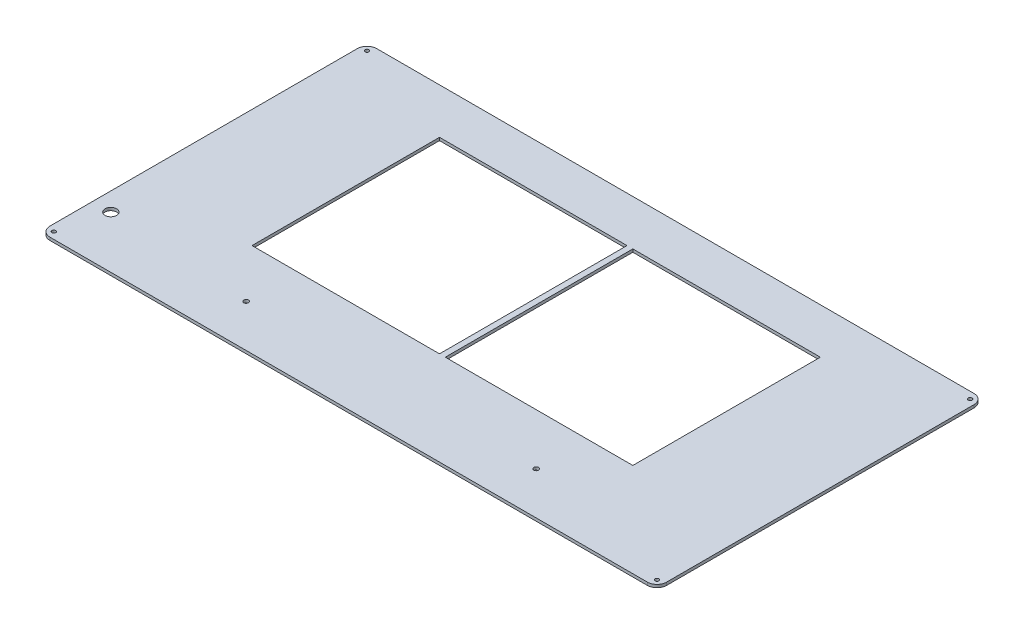
ISO-10303-21;
HEADER;
FILE_DESCRIPTION(('STEP AP214'),'2;1');
FILE_NAME('part.step','',(''),(''),'','','');
FILE_SCHEMA(('AUTOMOTIVE_DESIGN { 1 0 10303 214 1 1 1 1 }'));
ENDSEC;
DATA;
#1=APPLICATION_CONTEXT('core data for automotive mechanical design processes');
#2=APPLICATION_PROTOCOL_DEFINITION('international standard','automotive_design',2000,#1);
#3=PRODUCT_CONTEXT('',#1,'mechanical');
#4=PRODUCT('Part','Part','',(#3));
#5=PRODUCT_RELATED_PRODUCT_CATEGORY('part','',(#4));
#6=PRODUCT_DEFINITION_FORMATION('','',#4);
#7=PRODUCT_DEFINITION_CONTEXT('part definition',#1,'design');
#8=PRODUCT_DEFINITION('design','',#6,#7);
#9=PRODUCT_DEFINITION_SHAPE('','',#8);
#10=(LENGTH_UNIT() NAMED_UNIT(*) SI_UNIT(.MILLI.,.METRE.));
#11=(NAMED_UNIT(*) PLANE_ANGLE_UNIT() SI_UNIT($,.RADIAN.));
#12=(NAMED_UNIT(*) SI_UNIT($,.STERADIAN.) SOLID_ANGLE_UNIT());
#13=UNCERTAINTY_MEASURE_WITH_UNIT(LENGTH_MEASURE(1.E-05),#10,'distance_accuracy_value','');
#14=(GEOMETRIC_REPRESENTATION_CONTEXT(3) GLOBAL_UNCERTAINTY_ASSIGNED_CONTEXT((#13)) GLOBAL_UNIT_ASSIGNED_CONTEXT((#10,
#11,#12)) REPRESENTATION_CONTEXT('',''));
#15=CARTESIAN_POINT('',(0.,0.,0.));
#16=DIRECTION('',(0.,0.,1.));
#17=DIRECTION('',(1.,0.,0.));
#18=AXIS2_PLACEMENT_3D('',#15,#16,#17);
#19=CARTESIAN_POINT('',(0.,-3.,-344.));
#20=DIRECTION('',(0.,0.,-1.));
#21=DIRECTION('',(-1.,0.,0.));
#22=AXIS2_PLACEMENT_3D('',#19,#20,#21);
#23=PLANE('',#22);
#24=DIRECTION('',(-1.,0.,0.));
#25=VECTOR('',#24,1.);
#26=CARTESIAN_POINT('',(0.,0.,-344.));
#27=LINE('',#26,#25);
#28=CARTESIAN_POINT('',(634.,0.,-344.));
#29=VERTEX_POINT('',#28);
#30=CARTESIAN_POINT('',(16.0000000000001,0.,-344.));
#31=VERTEX_POINT('',#30);
#32=EDGE_CURVE('E257',#29,#31,#27,.T.);
#33=ORIENTED_EDGE('',*,*,#32,.F.);
#34=DIRECTION('',(0.,1.,0.));
#35=VECTOR('',#34,1.);
#36=CARTESIAN_POINT('',(634.,-3.,-344.));
#37=LINE('',#36,#35);
#38=CARTESIAN_POINT('',(634.,-3.,-344.));
#39=VERTEX_POINT('',#38);
#40=EDGE_CURVE('E11',#39,#29,#37,.T.);
#41=ORIENTED_EDGE('',*,*,#40,.F.);
#42=DIRECTION('',(-1.,0.,0.));
#43=VECTOR('',#42,1.);
#44=CARTESIAN_POINT('',(0.,-3.,-344.));
#45=LINE('',#44,#43);
#46=CARTESIAN_POINT('',(16.0000000000001,-3.,-344.));
#47=VERTEX_POINT('',#46);
#48=EDGE_CURVE('E320',#39,#47,#45,.T.);
#49=ORIENTED_EDGE('',*,*,#48,.T.);
#50=DIRECTION('',(0.,1.,0.));
#51=VECTOR('',#50,1.);
#52=CARTESIAN_POINT('',(16.0000000000001,-3.,-344.));
#53=LINE('',#52,#51);
#54=EDGE_CURVE('E190',#47,#31,#53,.T.);
#55=ORIENTED_EDGE('',*,*,#54,.T.);
#56=EDGE_LOOP('',(#33,#41,#49,#55));
#57=FACE_BOUND('',#56,.T.);
#58=ADVANCED_FACE('F37',(#57),#23,.T.);
#59=CARTESIAN_POINT('',(634.,-3.,-334.));
#60=DIRECTION('',(0.,1.,0.));
#61=DIRECTION('',(0.,0.,1.));
#62=AXIS2_PLACEMENT_3D('',#59,#60,#61);
#63=CYLINDRICAL_SURFACE('',#62,10.);
#64=CARTESIAN_POINT('',(634.,0.,-334.));
#65=DIRECTION('',(0.,1.,0.));
#66=DIRECTION('',(0.,0.,1.));
#67=AXIS2_PLACEMENT_3D('',#64,#65,#66);
#68=CIRCLE('',#67,10.);
#69=CARTESIAN_POINT('',(644.,0.,-334.));
#70=VERTEX_POINT('',#69);
#71=EDGE_CURVE('E275',#29,#70,#68,.F.);
#72=ORIENTED_EDGE('',*,*,#71,.T.);
#73=DIRECTION('',(0.,1.,0.));
#74=VECTOR('',#73,1.);
#75=CARTESIAN_POINT('',(644.,-3.,-334.));
#76=LINE('',#75,#74);
#77=CARTESIAN_POINT('',(644.,-3.,-334.));
#78=VERTEX_POINT('',#77);
#79=EDGE_CURVE('E47',#78,#70,#76,.T.);
#80=ORIENTED_EDGE('',*,*,#79,.F.);
#81=CARTESIAN_POINT('',(634.,-3.,-334.));
#82=DIRECTION('',(0.,1.,0.));
#83=DIRECTION('',(0.,0.,1.));
#84=AXIS2_PLACEMENT_3D('',#81,#82,#83);
#85=CIRCLE('',#84,10.);
#86=EDGE_CURVE('E175',#39,#78,#85,.F.);
#87=ORIENTED_EDGE('',*,*,#86,.F.);
#88=ORIENTED_EDGE('',*,*,#40,.T.);
#89=EDGE_LOOP('',(#72,#80,#87,#88));
#90=FACE_BOUND('',#89,.T.);
#91=ADVANCED_FACE('F357',(#90),#63,.T.);
#92=CARTESIAN_POINT('',(644.,-3.,0.));
#93=DIRECTION('',(-1.,0.,0.));
#94=DIRECTION('',(0.,0.,1.));
#95=AXIS2_PLACEMENT_3D('',#92,#93,#94);
#96=PLANE('',#95);
#97=DIRECTION('',(0.,0.,1.));
#98=VECTOR('',#97,1.);
#99=CARTESIAN_POINT('',(644.,0.,0.));
#100=LINE('',#99,#98);
#101=CARTESIAN_POINT('',(644.,0.,-16.0000000000001));
#102=VERTEX_POINT('',#101);
#103=EDGE_CURVE('E107',#70,#102,#100,.T.);
#104=ORIENTED_EDGE('',*,*,#103,.T.);
#105=DIRECTION('',(0.,1.,0.));
#106=VECTOR('',#105,1.);
#107=CARTESIAN_POINT('',(644.,-3.,-16.0000000000001));
#108=LINE('',#107,#106);
#109=CARTESIAN_POINT('',(644.,-3.,-16.0000000000001));
#110=VERTEX_POINT('',#109);
#111=EDGE_CURVE('E165',#110,#102,#108,.T.);
#112=ORIENTED_EDGE('',*,*,#111,.F.);
#113=DIRECTION('',(0.,0.,1.));
#114=VECTOR('',#113,1.);
#115=CARTESIAN_POINT('',(644.,-3.,0.));
#116=LINE('',#115,#114);
#117=EDGE_CURVE('E169',#78,#110,#116,.T.);
#118=ORIENTED_EDGE('',*,*,#117,.F.);
#119=ORIENTED_EDGE('',*,*,#79,.T.);
#120=EDGE_LOOP('',(#104,#112,#118,#119));
#121=FACE_BOUND('',#120,.T.);
#122=ADVANCED_FACE('F179',(#121),#96,.F.);
#123=CARTESIAN_POINT('',(634.,-3.,-16.));
#124=DIRECTION('',(0.,1.,0.));
#125=DIRECTION('',(0.,0.,1.));
#126=AXIS2_PLACEMENT_3D('',#123,#124,#125);
#127=CYLINDRICAL_SURFACE('',#126,10.);
#128=CARTESIAN_POINT('',(634.,0.,-16.));
#129=DIRECTION('',(0.,1.,0.));
#130=DIRECTION('',(0.,0.,1.));
#131=AXIS2_PLACEMENT_3D('',#128,#129,#130);
#132=CIRCLE('',#131,10.);
#133=CARTESIAN_POINT('',(634.,0.,-6.00000000000001));
#134=VERTEX_POINT('',#133);
#135=EDGE_CURVE('E272',#102,#134,#132,.F.);
#136=ORIENTED_EDGE('',*,*,#135,.T.);
#137=DIRECTION('',(0.,1.,0.));
#138=VECTOR('',#137,1.);
#139=CARTESIAN_POINT('',(634.,-3.,-6.00000000000001));
#140=LINE('',#139,#138);
#141=CARTESIAN_POINT('',(634.,-3.,-6.00000000000001));
#142=VERTEX_POINT('',#141);
#143=EDGE_CURVE('E167',#142,#134,#140,.T.);
#144=ORIENTED_EDGE('',*,*,#143,.F.);
#145=CARTESIAN_POINT('',(634.,-3.,-16.));
#146=DIRECTION('',(0.,1.,0.));
#147=DIRECTION('',(0.,0.,1.));
#148=AXIS2_PLACEMENT_3D('',#145,#146,#147);
#149=CIRCLE('',#148,10.);
#150=EDGE_CURVE('E160',#110,#142,#149,.F.);
#151=ORIENTED_EDGE('',*,*,#150,.F.);
#152=ORIENTED_EDGE('',*,*,#111,.T.);
#153=EDGE_LOOP('',(#136,#144,#151,#152));
#154=FACE_BOUND('',#153,.T.);
#155=ADVANCED_FACE('F163',(#154),#127,.T.);
#156=CARTESIAN_POINT('',(0.,-3.,-6.00000000000001));
#157=DIRECTION('',(0.,0.,-1.));
#158=DIRECTION('',(-1.,0.,0.));
#159=AXIS2_PLACEMENT_3D('',#156,#157,#158);
#160=PLANE('',#159);
#161=DIRECTION('',(-1.,0.,0.));
#162=VECTOR('',#161,1.);
#163=CARTESIAN_POINT('',(0.,0.,-6.00000000000001));
#164=LINE('',#163,#162);
#165=CARTESIAN_POINT('',(16.0000000000001,0.,-6.00000000000001));
#166=VERTEX_POINT('',#165);
#167=EDGE_CURVE('E269',#134,#166,#164,.T.);
#168=ORIENTED_EDGE('',*,*,#167,.T.);
#169=DIRECTION('',(0.,1.,0.));
#170=VECTOR('',#169,1.);
#171=CARTESIAN_POINT('',(16.0000000000001,-3.,-6.00000000000001));
#172=LINE('',#171,#170);
#173=CARTESIAN_POINT('',(16.0000000000001,-3.,-6.00000000000001));
#174=VERTEX_POINT('',#173);
#175=EDGE_CURVE('E182',#174,#166,#172,.T.);
#176=ORIENTED_EDGE('',*,*,#175,.F.);
#177=DIRECTION('',(-1.,0.,0.));
#178=VECTOR('',#177,1.);
#179=CARTESIAN_POINT('',(0.,-3.,-6.00000000000001));
#180=LINE('',#179,#178);
#181=EDGE_CURVE('E170',#142,#174,#180,.T.);
#182=ORIENTED_EDGE('',*,*,#181,.F.);
#183=ORIENTED_EDGE('',*,*,#143,.T.);
#184=EDGE_LOOP('',(#168,#176,#182,#183));
#185=FACE_BOUND('',#184,.T.);
#186=ADVANCED_FACE('F333',(#185),#160,.F.);
#187=CARTESIAN_POINT('',(16.,-3.,-16.));
#188=DIRECTION('',(0.,1.,0.));
#189=DIRECTION('',(0.,0.,1.));
#190=AXIS2_PLACEMENT_3D('',#187,#188,#189);
#191=CYLINDRICAL_SURFACE('',#190,10.);
#192=CARTESIAN_POINT('',(16.,0.,-16.));
#193=DIRECTION('',(0.,1.,0.));
#194=DIRECTION('',(0.,0.,1.));
#195=AXIS2_PLACEMENT_3D('',#192,#193,#194);
#196=CIRCLE('',#195,10.);
#197=CARTESIAN_POINT('',(6.00000000000001,0.,-16.0000000000001));
#198=VERTEX_POINT('',#197);
#199=EDGE_CURVE('E266',#198,#166,#196,.T.);
#200=ORIENTED_EDGE('',*,*,#199,.F.);
#201=DIRECTION('',(0.,1.,0.));
#202=VECTOR('',#201,1.);
#203=CARTESIAN_POINT('',(6.00000000000001,-3.,-16.0000000000001));
#204=LINE('',#203,#202);
#205=CARTESIAN_POINT('',(6.00000000000001,-3.,-16.0000000000001));
#206=VERTEX_POINT('',#205);
#207=EDGE_CURVE('E186',#206,#198,#204,.T.);
#208=ORIENTED_EDGE('',*,*,#207,.F.);
#209=CARTESIAN_POINT('',(16.,-3.,-16.));
#210=DIRECTION('',(0.,1.,0.));
#211=DIRECTION('',(0.,0.,1.));
#212=AXIS2_PLACEMENT_3D('',#209,#210,#211);
#213=CIRCLE('',#212,10.);
#214=EDGE_CURVE('E327',#206,#174,#213,.T.);
#215=ORIENTED_EDGE('',*,*,#214,.T.);
#216=ORIENTED_EDGE('',*,*,#175,.T.);
#217=EDGE_LOOP('',(#200,#208,#215,#216));
#218=FACE_BOUND('',#217,.T.);
#219=ADVANCED_FACE('F336',(#218),#191,.T.);
#220=CARTESIAN_POINT('',(6.00000000000001,-3.,0.));
#221=DIRECTION('',(1.,0.,0.));
#222=DIRECTION('',(0.,0.,-1.));
#223=AXIS2_PLACEMENT_3D('',#220,#221,#222);
#224=PLANE('',#223);
#225=DIRECTION('',(0.,0.,-1.));
#226=VECTOR('',#225,1.);
#227=CARTESIAN_POINT('',(6.00000000000001,0.,0.));
#228=LINE('',#227,#226);
#229=CARTESIAN_POINT('',(6.00000000000001,0.,-334.));
#230=VERTEX_POINT('',#229);
#231=EDGE_CURVE('E263',#198,#230,#228,.T.);
#232=ORIENTED_EDGE('',*,*,#231,.T.);
#233=DIRECTION('',(0.,1.,0.));
#234=VECTOR('',#233,1.);
#235=CARTESIAN_POINT('',(6.00000000000001,-3.,-334.));
#236=LINE('',#235,#234);
#237=CARTESIAN_POINT('',(6.00000000000001,-3.,-334.));
#238=VERTEX_POINT('',#237);
#239=EDGE_CURVE('E188',#238,#230,#236,.T.);
#240=ORIENTED_EDGE('',*,*,#239,.F.);
#241=DIRECTION('',(0.,0.,-1.));
#242=VECTOR('',#241,1.);
#243=CARTESIAN_POINT('',(6.00000000000001,-3.,0.));
#244=LINE('',#243,#242);
#245=EDGE_CURVE('E325',#206,#238,#244,.T.);
#246=ORIENTED_EDGE('',*,*,#245,.F.);
#247=ORIENTED_EDGE('',*,*,#207,.T.);
#248=EDGE_LOOP('',(#232,#240,#246,#247));
#249=FACE_BOUND('',#248,.T.);
#250=ADVANCED_FACE('F341',(#249),#224,.F.);
#251=CARTESIAN_POINT('',(0.,-3.,-103.));
#252=DIRECTION('',(0.,0.,-1.));
#253=DIRECTION('',(-1.,0.,0.));
#254=AXIS2_PLACEMENT_3D('',#251,#252,#253);
#255=PLANE('',#254);
#256=DIRECTION('',(-1.,0.,0.));
#257=VECTOR('',#256,1.);
#258=CARTESIAN_POINT('',(0.,0.,-103.));
#259=LINE('',#258,#257);
#260=CARTESIAN_POINT('',(522.,0.,-103.));
#261=VERTEX_POINT('',#260);
#262=CARTESIAN_POINT('',(328.,0.,-103.));
#263=VERTEX_POINT('',#262);
#264=EDGE_CURVE('E224',#261,#263,#259,.T.);
#265=ORIENTED_EDGE('',*,*,#264,.F.);
#266=DIRECTION('',(0.,1.,0.));
#267=VECTOR('',#266,1.);
#268=CARTESIAN_POINT('',(522.,-3.,-103.));
#269=LINE('',#268,#267);
#270=CARTESIAN_POINT('',(522.,-3.,-103.));
#271=VERTEX_POINT('',#270);
#272=EDGE_CURVE('E192',#271,#261,#269,.T.);
#273=ORIENTED_EDGE('',*,*,#272,.F.);
#274=DIRECTION('',(-1.,0.,0.));
#275=VECTOR('',#274,1.);
#276=CARTESIAN_POINT('',(0.,-3.,-103.));
#277=LINE('',#276,#275);
#278=CARTESIAN_POINT('',(328.,-3.,-103.));
#279=VERTEX_POINT('',#278);
#280=EDGE_CURVE('E288',#271,#279,#277,.T.);
#281=ORIENTED_EDGE('',*,*,#280,.T.);
#282=DIRECTION('',(0.,1.,0.));
#283=VECTOR('',#282,1.);
#284=CARTESIAN_POINT('',(328.,-3.,-103.));
#285=LINE('',#284,#283);
#286=EDGE_CURVE('E199',#279,#263,#285,.T.);
#287=ORIENTED_EDGE('',*,*,#286,.T.);
#288=EDGE_LOOP('',(#265,#273,#281,#287));
#289=FACE_BOUND('',#288,.T.);
#290=ADVANCED_FACE('F399',(#289),#255,.T.);
#291=CARTESIAN_POINT('',(522.,-3.,0.));
#292=DIRECTION('',(1.,0.,0.));
#293=DIRECTION('',(0.,0.,-1.));
#294=AXIS2_PLACEMENT_3D('',#291,#292,#293);
#295=PLANE('',#294);
#296=DIRECTION('',(0.,0.,-1.));
#297=VECTOR('',#296,1.);
#298=CARTESIAN_POINT('',(522.,0.,0.));
#299=LINE('',#298,#297);
#300=CARTESIAN_POINT('',(522.,0.,-297.));
#301=VERTEX_POINT('',#300);
#302=EDGE_CURVE('E233',#261,#301,#299,.T.);
#303=ORIENTED_EDGE('',*,*,#302,.T.);
#304=DIRECTION('',(0.,1.,0.));
#305=VECTOR('',#304,1.);
#306=CARTESIAN_POINT('',(522.,-3.,-297.));
#307=LINE('',#306,#305);
#308=CARTESIAN_POINT('',(522.,-3.,-297.));
#309=VERTEX_POINT('',#308);
#310=EDGE_CURVE('E194',#309,#301,#307,.T.);
#311=ORIENTED_EDGE('',*,*,#310,.F.);
#312=DIRECTION('',(0.,0.,-1.));
#313=VECTOR('',#312,1.);
#314=CARTESIAN_POINT('',(522.,-3.,0.));
#315=LINE('',#314,#313);
#316=EDGE_CURVE('E296',#271,#309,#315,.T.);
#317=ORIENTED_EDGE('',*,*,#316,.F.);
#318=ORIENTED_EDGE('',*,*,#272,.T.);
#319=EDGE_LOOP('',(#303,#311,#317,#318));
#320=FACE_BOUND('',#319,.T.);
#321=ADVANCED_FACE('F395',(#320),#295,.F.);
#322=CARTESIAN_POINT('',(0.,-3.,-297.));
#323=DIRECTION('',(0.,0.,-1.));
#324=DIRECTION('',(-1.,0.,0.));
#325=AXIS2_PLACEMENT_3D('',#322,#323,#324);
#326=PLANE('',#325);
#327=DIRECTION('',(-1.,0.,0.));
#328=VECTOR('',#327,1.);
#329=CARTESIAN_POINT('',(0.,0.,-297.));
#330=LINE('',#329,#328);
#331=CARTESIAN_POINT('',(328.,0.,-297.));
#332=VERTEX_POINT('',#331);
#333=EDGE_CURVE('E230',#301,#332,#330,.T.);
#334=ORIENTED_EDGE('',*,*,#333,.T.);
#335=DIRECTION('',(0.,1.,0.));
#336=VECTOR('',#335,1.);
#337=CARTESIAN_POINT('',(328.,-3.,-297.));
#338=LINE('',#337,#336);
#339=CARTESIAN_POINT('',(328.,-3.,-297.));
#340=VERTEX_POINT('',#339);
#341=EDGE_CURVE('E197',#340,#332,#338,.T.);
#342=ORIENTED_EDGE('',*,*,#341,.F.);
#343=DIRECTION('',(-1.,0.,0.));
#344=VECTOR('',#343,1.);
#345=CARTESIAN_POINT('',(0.,-3.,-297.));
#346=LINE('',#345,#344);
#347=EDGE_CURVE('E294',#309,#340,#346,.T.);
#348=ORIENTED_EDGE('',*,*,#347,.F.);
#349=ORIENTED_EDGE('',*,*,#310,.T.);
#350=EDGE_LOOP('',(#334,#342,#348,#349));
#351=FACE_BOUND('',#350,.T.);
#352=ADVANCED_FACE('F398',(#351),#326,.F.);
#353=CARTESIAN_POINT('',(0.,-3.,-297.));
#354=DIRECTION('',(0.,0.,-1.));
#355=DIRECTION('',(-1.,0.,0.));
#356=AXIS2_PLACEMENT_3D('',#353,#354,#355);
#357=PLANE('',#356);
#358=DIRECTION('',(-1.,0.,0.));
#359=VECTOR('',#358,1.);
#360=CARTESIAN_POINT('',(0.,0.,-297.));
#361=LINE('',#360,#359);
#362=CARTESIAN_POINT('',(322.,0.,-297.));
#363=VERTEX_POINT('',#362);
#364=CARTESIAN_POINT('',(128.,0.,-297.));
#365=VERTEX_POINT('',#364);
#366=EDGE_CURVE('E214',#363,#365,#361,.T.);
#367=ORIENTED_EDGE('',*,*,#366,.T.);
#368=DIRECTION('',(0.,1.,0.));
#369=VECTOR('',#368,1.);
#370=CARTESIAN_POINT('',(128.,-3.,-297.));
#371=LINE('',#370,#369);
#372=CARTESIAN_POINT('',(128.,-3.,-297.));
#373=VERTEX_POINT('',#372);
#374=EDGE_CURVE('E201',#373,#365,#371,.T.);
#375=ORIENTED_EDGE('',*,*,#374,.F.);
#376=DIRECTION('',(-1.,0.,0.));
#377=VECTOR('',#376,1.);
#378=CARTESIAN_POINT('',(0.,-3.,-297.));
#379=LINE('',#378,#377);
#380=CARTESIAN_POINT('',(322.,-3.,-297.));
#381=VERTEX_POINT('',#380);
#382=EDGE_CURVE('E276',#381,#373,#379,.T.);
#383=ORIENTED_EDGE('',*,*,#382,.F.);
#384=DIRECTION('',(0.,1.,0.));
#385=VECTOR('',#384,1.);
#386=CARTESIAN_POINT('',(322.,-3.,-297.));
#387=LINE('',#386,#385);
#388=EDGE_CURVE('E41',#381,#363,#387,.T.);
#389=ORIENTED_EDGE('',*,*,#388,.T.);
#390=EDGE_LOOP('',(#367,#375,#383,#389));
#391=FACE_BOUND('',#390,.T.);
#392=ADVANCED_FACE('F39',(#391),#357,.F.);
#393=CARTESIAN_POINT('',(128.,-3.,0.));
#394=DIRECTION('',(1.,0.,0.));
#395=DIRECTION('',(0.,0.,-1.));
#396=AXIS2_PLACEMENT_3D('',#393,#394,#395);
#397=PLANE('',#396);
#398=DIRECTION('',(0.,0.,-1.));
#399=VECTOR('',#398,1.);
#400=CARTESIAN_POINT('',(128.,0.,0.));
#401=LINE('',#400,#399);
#402=CARTESIAN_POINT('',(128.,0.,-103.));
#403=VERTEX_POINT('',#402);
#404=EDGE_CURVE('E221',#403,#365,#401,.T.);
#405=ORIENTED_EDGE('',*,*,#404,.F.);
#406=DIRECTION('',(0.,1.,0.));
#407=VECTOR('',#406,1.);
#408=CARTESIAN_POINT('',(128.,-3.,-103.));
#409=LINE('',#408,#407);
#410=CARTESIAN_POINT('',(128.,-3.,-103.));
#411=VERTEX_POINT('',#410);
#412=EDGE_CURVE('E203',#411,#403,#409,.T.);
#413=ORIENTED_EDGE('',*,*,#412,.F.);
#414=DIRECTION('',(0.,0.,-1.));
#415=VECTOR('',#414,1.);
#416=CARTESIAN_POINT('',(128.,-3.,0.));
#417=LINE('',#416,#415);
#418=EDGE_CURVE('E285',#411,#373,#417,.T.);
#419=ORIENTED_EDGE('',*,*,#418,.T.);
#420=ORIENTED_EDGE('',*,*,#374,.T.);
#421=EDGE_LOOP('',(#405,#413,#419,#420));
#422=FACE_BOUND('',#421,.T.);
#423=ADVANCED_FACE('F411',(#422),#397,.T.);
#424=CARTESIAN_POINT('',(0.,-3.,-103.));
#425=DIRECTION('',(0.,0.,-1.));
#426=DIRECTION('',(-1.,0.,0.));
#427=AXIS2_PLACEMENT_3D('',#424,#425,#426);
#428=PLANE('',#427);
#429=DIRECTION('',(-1.,0.,0.));
#430=VECTOR('',#429,1.);
#431=CARTESIAN_POINT('',(0.,0.,-103.));
#432=LINE('',#431,#430);
#433=CARTESIAN_POINT('',(322.,0.,-103.));
#434=VERTEX_POINT('',#433);
#435=EDGE_CURVE('E218',#434,#403,#432,.T.);
#436=ORIENTED_EDGE('',*,*,#435,.F.);
#437=DIRECTION('',(0.,1.,0.));
#438=VECTOR('',#437,1.);
#439=CARTESIAN_POINT('',(322.,-3.,-103.));
#440=LINE('',#439,#438);
#441=CARTESIAN_POINT('',(322.,-3.,-103.));
#442=VERTEX_POINT('',#441);
#443=EDGE_CURVE('E204',#442,#434,#440,.T.);
#444=ORIENTED_EDGE('',*,*,#443,.F.);
#445=DIRECTION('',(-1.,0.,0.));
#446=VECTOR('',#445,1.);
#447=CARTESIAN_POINT('',(0.,-3.,-103.));
#448=LINE('',#447,#446);
#449=EDGE_CURVE('E280',#442,#411,#448,.T.);
#450=ORIENTED_EDGE('',*,*,#449,.T.);
#451=ORIENTED_EDGE('',*,*,#412,.T.);
#452=EDGE_LOOP('',(#436,#444,#450,#451));
#453=FACE_BOUND('',#452,.T.);
#454=ADVANCED_FACE('F369',(#453),#428,.T.);
#455=CARTESIAN_POINT('',(25.,-3.,-60.));
#456=DIRECTION('',(0.,1.,0.));
#457=DIRECTION('',(0.,0.,1.));
#458=AXIS2_PLACEMENT_3D('',#455,#456,#457);
#459=CYLINDRICAL_SURFACE('',#458,6.00000000000001);
#460=CARTESIAN_POINT('',(25.,-3.,-60.));
#461=DIRECTION('',(0.,1.,0.));
#462=DIRECTION('',(0.,0.,1.));
#463=AXIS2_PLACEMENT_3D('',#460,#461,#462);
#464=CIRCLE('',#463,6.00000000000001);
#465=CARTESIAN_POINT('',(25.,-3.,-54.));
#466=VERTEX_POINT('',#465);
#467=EDGE_CURVE('E317',#466,#466,#464,.T.);
#468=ORIENTED_EDGE('',*,*,#467,.F.);
#469=EDGE_LOOP('',(#468));
#470=FACE_BOUND('',#469,.T.);
#471=CARTESIAN_POINT('',(25.,0.,-60.));
#472=DIRECTION('',(0.,1.,0.));
#473=DIRECTION('',(0.,0.,1.));
#474=AXIS2_PLACEMENT_3D('',#471,#472,#473);
#475=CIRCLE('',#474,6.00000000000001);
#476=CARTESIAN_POINT('',(25.,0.,-54.));
#477=VERTEX_POINT('',#476);
#478=EDGE_CURVE('E254',#477,#477,#475,.T.);
#479=ORIENTED_EDGE('',*,*,#478,.T.);
#480=EDGE_LOOP('',(#479));
#481=FACE_BOUND('',#480,.T.);
#482=ADVANCED_FACE('F365',(#470,#481),#459,.F.);
#483=CARTESIAN_POINT('',(175.,-3.,-50.));
#484=DIRECTION('',(0.,1.,0.));
#485=DIRECTION('',(0.,0.,1.));
#486=AXIS2_PLACEMENT_3D('',#483,#484,#485);
#487=CYLINDRICAL_SURFACE('',#486,2.50000000000002);
#488=CARTESIAN_POINT('',(175.,-3.,-50.));
#489=DIRECTION('',(0.,1.,0.));
#490=DIRECTION('',(0.,0.,1.));
#491=AXIS2_PLACEMENT_3D('',#488,#489,#490);
#492=CIRCLE('',#491,2.50000000000002);
#493=CARTESIAN_POINT('',(175.,-3.,-47.5));
#494=VERTEX_POINT('',#493);
#495=EDGE_CURVE('E314',#494,#494,#492,.T.);
#496=ORIENTED_EDGE('',*,*,#495,.F.);
#497=EDGE_LOOP('',(#496));
#498=FACE_BOUND('',#497,.T.);
#499=CARTESIAN_POINT('',(175.,0.,-50.));
#500=DIRECTION('',(0.,1.,0.));
#501=DIRECTION('',(0.,0.,1.));
#502=AXIS2_PLACEMENT_3D('',#499,#500,#501);
#503=CIRCLE('',#502,2.50000000000002);
#504=CARTESIAN_POINT('',(175.,0.,-47.5));
#505=VERTEX_POINT('',#504);
#506=EDGE_CURVE('E251',#505,#505,#503,.T.);
#507=ORIENTED_EDGE('',*,*,#506,.T.);
#508=EDGE_LOOP('',(#507));
#509=FACE_BOUND('',#508,.T.);
#510=ADVANCED_FACE('F368',(#498,#509),#487,.F.);
#511=CARTESIAN_POINT('',(475.,-3.,-50.));
#512=DIRECTION('',(0.,1.,0.));
#513=DIRECTION('',(0.,0.,1.));
#514=AXIS2_PLACEMENT_3D('',#511,#512,#513);
#515=CYLINDRICAL_SURFACE('',#514,2.50000000000002);
#516=CARTESIAN_POINT('',(475.,-3.,-50.));
#517=DIRECTION('',(0.,1.,0.));
#518=DIRECTION('',(0.,0.,1.));
#519=AXIS2_PLACEMENT_3D('',#516,#517,#518);
#520=CIRCLE('',#519,2.50000000000002);
#521=CARTESIAN_POINT('',(475.,-3.,-47.5));
#522=VERTEX_POINT('',#521);
#523=EDGE_CURVE('E311',#522,#522,#520,.T.);
#524=ORIENTED_EDGE('',*,*,#523,.F.);
#525=EDGE_LOOP('',(#524));
#526=FACE_BOUND('',#525,.T.);
#527=CARTESIAN_POINT('',(475.,0.,-50.));
#528=DIRECTION('',(0.,1.,0.));
#529=DIRECTION('',(0.,0.,1.));
#530=AXIS2_PLACEMENT_3D('',#527,#528,#529);
#531=CIRCLE('',#530,2.50000000000002);
#532=CARTESIAN_POINT('',(475.,0.,-47.5));
#533=VERTEX_POINT('',#532);
#534=EDGE_CURVE('E248',#533,#533,#531,.T.);
#535=ORIENTED_EDGE('',*,*,#534,.T.);
#536=EDGE_LOOP('',(#535));
#537=FACE_BOUND('',#536,.T.);
#538=ADVANCED_FACE('F373',(#526,#537),#515,.F.);
#539=CARTESIAN_POINT('',(637.,-3.,-337.));
#540=DIRECTION('',(0.,1.,0.));
#541=DIRECTION('',(0.,0.,1.));
#542=AXIS2_PLACEMENT_3D('',#539,#540,#541);
#543=CYLINDRICAL_SURFACE('',#542,2.);
#544=CARTESIAN_POINT('',(637.,-3.,-337.));
#545=DIRECTION('',(0.,1.,0.));
#546=DIRECTION('',(0.,0.,1.));
#547=AXIS2_PLACEMENT_3D('',#544,#545,#546);
#548=CIRCLE('',#547,2.);
#549=CARTESIAN_POINT('',(637.,-3.,-335.));
#550=VERTEX_POINT('',#549);
#551=EDGE_CURVE('E308',#550,#550,#548,.T.);
#552=ORIENTED_EDGE('',*,*,#551,.F.);
#553=EDGE_LOOP('',(#552));
#554=FACE_BOUND('',#553,.T.);
#555=CARTESIAN_POINT('',(637.,0.,-337.));
#556=DIRECTION('',(0.,1.,0.));
#557=DIRECTION('',(0.,0.,1.));
#558=AXIS2_PLACEMENT_3D('',#555,#556,#557);
#559=CIRCLE('',#558,2.);
#560=CARTESIAN_POINT('',(637.,0.,-335.));
#561=VERTEX_POINT('',#560);
#562=EDGE_CURVE('E245',#561,#561,#559,.T.);
#563=ORIENTED_EDGE('',*,*,#562,.T.);
#564=EDGE_LOOP('',(#563));
#565=FACE_BOUND('',#564,.T.);
#566=ADVANCED_FACE('F377',(#554,#565),#543,.F.);
#567=CARTESIAN_POINT('',(13.,-3.,-337.));
#568=DIRECTION('',(0.,1.,0.));
#569=DIRECTION('',(0.,0.,1.));
#570=AXIS2_PLACEMENT_3D('',#567,#568,#569);
#571=CYLINDRICAL_SURFACE('',#570,2.);
#572=CARTESIAN_POINT('',(13.,-3.,-337.));
#573=DIRECTION('',(0.,1.,0.));
#574=DIRECTION('',(0.,0.,1.));
#575=AXIS2_PLACEMENT_3D('',#572,#573,#574);
#576=CIRCLE('',#575,2.);
#577=CARTESIAN_POINT('',(13.,-3.,-335.));
#578=VERTEX_POINT('',#577);
#579=EDGE_CURVE('E305',#578,#578,#576,.T.);
#580=ORIENTED_EDGE('',*,*,#579,.F.);
#581=EDGE_LOOP('',(#580));
#582=FACE_BOUND('',#581,.T.);
#583=CARTESIAN_POINT('',(13.,0.,-337.));
#584=DIRECTION('',(0.,1.,0.));
#585=DIRECTION('',(0.,0.,1.));
#586=AXIS2_PLACEMENT_3D('',#583,#584,#585);
#587=CIRCLE('',#586,2.);
#588=CARTESIAN_POINT('',(13.,0.,-335.));
#589=VERTEX_POINT('',#588);
#590=EDGE_CURVE('E242',#589,#589,#587,.T.);
#591=ORIENTED_EDGE('',*,*,#590,.T.);
#592=EDGE_LOOP('',(#591));
#593=FACE_BOUND('',#592,.T.);
#594=ADVANCED_FACE('F381',(#582,#593),#571,.F.);
#595=CARTESIAN_POINT('',(637.,-3.,-13.));
#596=DIRECTION('',(0.,1.,0.));
#597=DIRECTION('',(0.,0.,1.));
#598=AXIS2_PLACEMENT_3D('',#595,#596,#597);
#599=CYLINDRICAL_SURFACE('',#598,2.);
#600=CARTESIAN_POINT('',(637.,-3.,-13.));
#601=DIRECTION('',(0.,1.,0.));
#602=DIRECTION('',(0.,0.,1.));
#603=AXIS2_PLACEMENT_3D('',#600,#601,#602);
#604=CIRCLE('',#603,2.);
#605=CARTESIAN_POINT('',(637.,-3.,-11.));
#606=VERTEX_POINT('',#605);
#607=EDGE_CURVE('E302',#606,#606,#604,.T.);
#608=ORIENTED_EDGE('',*,*,#607,.F.);
#609=EDGE_LOOP('',(#608));
#610=FACE_BOUND('',#609,.T.);
#611=CARTESIAN_POINT('',(637.,0.,-13.));
#612=DIRECTION('',(0.,1.,0.));
#613=DIRECTION('',(0.,0.,1.));
#614=AXIS2_PLACEMENT_3D('',#611,#612,#613);
#615=CIRCLE('',#614,2.);
#616=CARTESIAN_POINT('',(637.,0.,-11.));
#617=VERTEX_POINT('',#616);
#618=EDGE_CURVE('E239',#617,#617,#615,.T.);
#619=ORIENTED_EDGE('',*,*,#618,.T.);
#620=EDGE_LOOP('',(#619));
#621=FACE_BOUND('',#620,.T.);
#622=ADVANCED_FACE('F385',(#610,#621),#599,.F.);
#623=CARTESIAN_POINT('',(13.,-3.,-13.));
#624=DIRECTION('',(0.,1.,0.));
#625=DIRECTION('',(0.,0.,1.));
#626=AXIS2_PLACEMENT_3D('',#623,#624,#625);
#627=CYLINDRICAL_SURFACE('',#626,2.);
#628=CARTESIAN_POINT('',(13.,-3.,-13.));
#629=DIRECTION('',(0.,1.,0.));
#630=DIRECTION('',(0.,0.,1.));
#631=AXIS2_PLACEMENT_3D('',#628,#629,#630);
#632=CIRCLE('',#631,2.);
#633=CARTESIAN_POINT('',(13.,-3.,-11.));
#634=VERTEX_POINT('',#633);
#635=EDGE_CURVE('E299',#634,#634,#632,.T.);
#636=ORIENTED_EDGE('',*,*,#635,.F.);
#637=EDGE_LOOP('',(#636));
#638=FACE_BOUND('',#637,.T.);
#639=CARTESIAN_POINT('',(13.,0.,-13.));
#640=DIRECTION('',(0.,1.,0.));
#641=DIRECTION('',(0.,0.,1.));
#642=AXIS2_PLACEMENT_3D('',#639,#640,#641);
#643=CIRCLE('',#642,2.);
#644=CARTESIAN_POINT('',(13.,0.,-11.));
#645=VERTEX_POINT('',#644);
#646=EDGE_CURVE('E236',#645,#645,#643,.T.);
#647=ORIENTED_EDGE('',*,*,#646,.T.);
#648=EDGE_LOOP('',(#647));
#649=FACE_BOUND('',#648,.T.);
#650=ADVANCED_FACE('F389',(#638,#649),#627,.F.);
#651=CARTESIAN_POINT('',(328.,-3.,0.));
#652=DIRECTION('',(1.,0.,0.));
#653=DIRECTION('',(0.,0.,-1.));
#654=AXIS2_PLACEMENT_3D('',#651,#652,#653);
#655=PLANE('',#654);
#656=DIRECTION('',(0.,0.,-1.));
#657=VECTOR('',#656,1.);
#658=CARTESIAN_POINT('',(328.,0.,0.));
#659=LINE('',#658,#657);
#660=EDGE_CURVE('E227',#263,#332,#659,.T.);
#661=ORIENTED_EDGE('',*,*,#660,.F.);
#662=ORIENTED_EDGE('',*,*,#286,.F.);
#663=DIRECTION('',(0.,0.,-1.));
#664=VECTOR('',#663,1.);
#665=CARTESIAN_POINT('',(328.,-3.,0.));
#666=LINE('',#665,#664);
#667=EDGE_CURVE('E291',#279,#340,#666,.T.);
#668=ORIENTED_EDGE('',*,*,#667,.T.);
#669=ORIENTED_EDGE('',*,*,#341,.T.);
#670=EDGE_LOOP('',(#661,#662,#668,#669));
#671=FACE_BOUND('',#670,.T.);
#672=ADVANCED_FACE('F393',(#671),#655,.T.);
#673=CARTESIAN_POINT('',(322.,-3.,0.));
#674=DIRECTION('',(1.,0.,0.));
#675=DIRECTION('',(0.,0.,-1.));
#676=AXIS2_PLACEMENT_3D('',#673,#674,#675);
#677=PLANE('',#676);
#678=DIRECTION('',(0.,0.,-1.));
#679=VECTOR('',#678,1.);
#680=CARTESIAN_POINT('',(322.,0.,0.));
#681=LINE('',#680,#679);
#682=EDGE_CURVE('E216',#434,#363,#681,.T.);
#683=ORIENTED_EDGE('',*,*,#682,.T.);
#684=ORIENTED_EDGE('',*,*,#388,.F.);
#685=DIRECTION('',(0.,0.,-1.));
#686=VECTOR('',#685,1.);
#687=CARTESIAN_POINT('',(322.,-3.,0.));
#688=LINE('',#687,#686);
#689=EDGE_CURVE('E119',#442,#381,#688,.T.);
#690=ORIENTED_EDGE('',*,*,#689,.F.);
#691=ORIENTED_EDGE('',*,*,#443,.T.);
#692=EDGE_LOOP('',(#683,#684,#690,#691));
#693=FACE_BOUND('',#692,.T.);
#694=ADVANCED_FACE('F406',(#693),#677,.F.);
#695=CARTESIAN_POINT('',(16.,-3.,-334.));
#696=DIRECTION('',(0.,1.,0.));
#697=DIRECTION('',(0.,0.,1.));
#698=AXIS2_PLACEMENT_3D('',#695,#696,#697);
#699=CYLINDRICAL_SURFACE('',#698,10.);
#700=CARTESIAN_POINT('',(16.,0.,-334.));
#701=DIRECTION('',(0.,1.,0.));
#702=DIRECTION('',(0.,0.,1.));
#703=AXIS2_PLACEMENT_3D('',#700,#701,#702);
#704=CIRCLE('',#703,10.);
#705=EDGE_CURVE('E260',#31,#230,#704,.T.);
#706=ORIENTED_EDGE('',*,*,#705,.F.);
#707=ORIENTED_EDGE('',*,*,#54,.F.);
#708=CARTESIAN_POINT('',(16.,-3.,-334.));
#709=DIRECTION('',(0.,1.,0.));
#710=DIRECTION('',(0.,0.,1.));
#711=AXIS2_PLACEMENT_3D('',#708,#709,#710);
#712=CIRCLE('',#711,10.);
#713=EDGE_CURVE('E322',#47,#238,#712,.T.);
#714=ORIENTED_EDGE('',*,*,#713,.T.);
#715=ORIENTED_EDGE('',*,*,#239,.T.);
#716=EDGE_LOOP('',(#706,#707,#714,#715));
#717=FACE_BOUND('',#716,.T.);
#718=ADVANCED_FACE('F345',(#717),#699,.T.);
#719=CARTESIAN_POINT('',(0.,-3.,0.));
#720=DIRECTION('',(0.,1.,0.));
#721=DIRECTION('',(0.,0.,1.));
#722=AXIS2_PLACEMENT_3D('',#719,#720,#721);
#723=PLANE('',#722);
#724=ORIENTED_EDGE('',*,*,#382,.T.);
#725=ORIENTED_EDGE('',*,*,#418,.F.);
#726=ORIENTED_EDGE('',*,*,#449,.F.);
#727=ORIENTED_EDGE('',*,*,#689,.T.);
#728=EDGE_LOOP('',(#724,#725,#726,#727));
#729=FACE_BOUND('',#728,.T.);
#730=ORIENTED_EDGE('',*,*,#280,.F.);
#731=ORIENTED_EDGE('',*,*,#316,.T.);
#732=ORIENTED_EDGE('',*,*,#347,.T.);
#733=ORIENTED_EDGE('',*,*,#667,.F.);
#734=EDGE_LOOP('',(#730,#731,#732,#733));
#735=FACE_BOUND('',#734,.T.);
#736=ORIENTED_EDGE('',*,*,#635,.T.);
#737=EDGE_LOOP('',(#736));
#738=FACE_BOUND('',#737,.T.);
#739=ORIENTED_EDGE('',*,*,#607,.T.);
#740=EDGE_LOOP('',(#739));
#741=FACE_BOUND('',#740,.T.);
#742=ORIENTED_EDGE('',*,*,#579,.T.);
#743=EDGE_LOOP('',(#742));
#744=FACE_BOUND('',#743,.T.);
#745=ORIENTED_EDGE('',*,*,#551,.T.);
#746=EDGE_LOOP('',(#745));
#747=FACE_BOUND('',#746,.T.);
#748=ORIENTED_EDGE('',*,*,#523,.T.);
#749=EDGE_LOOP('',(#748));
#750=FACE_BOUND('',#749,.T.);
#751=ORIENTED_EDGE('',*,*,#495,.T.);
#752=EDGE_LOOP('',(#751));
#753=FACE_BOUND('',#752,.T.);
#754=ORIENTED_EDGE('',*,*,#467,.T.);
#755=EDGE_LOOP('',(#754));
#756=FACE_BOUND('',#755,.T.);
#757=ORIENTED_EDGE('',*,*,#48,.F.);
#758=ORIENTED_EDGE('',*,*,#86,.T.);
#759=ORIENTED_EDGE('',*,*,#117,.T.);
#760=ORIENTED_EDGE('',*,*,#150,.T.);
#761=ORIENTED_EDGE('',*,*,#181,.T.);
#762=ORIENTED_EDGE('',*,*,#214,.F.);
#763=ORIENTED_EDGE('',*,*,#245,.T.);
#764=ORIENTED_EDGE('',*,*,#713,.F.);
#765=EDGE_LOOP('',(#757,#758,#759,#760,#761,#762,#763,#764));
#766=FACE_BOUND('',#765,.T.);
#767=ADVANCED_FACE('F174',(#729,#735,#738,#741,#744,#747,#750,#753,#756,#766),#723,.F.);
#768=CARTESIAN_POINT('',(0.,0.,0.));
#769=DIRECTION('',(0.,1.,0.));
#770=DIRECTION('',(0.,0.,1.));
#771=AXIS2_PLACEMENT_3D('',#768,#769,#770);
#772=PLANE('',#771);
#773=ORIENTED_EDGE('',*,*,#366,.F.);
#774=ORIENTED_EDGE('',*,*,#682,.F.);
#775=ORIENTED_EDGE('',*,*,#435,.T.);
#776=ORIENTED_EDGE('',*,*,#404,.T.);
#777=EDGE_LOOP('',(#773,#774,#775,#776));
#778=FACE_BOUND('',#777,.T.);
#779=ORIENTED_EDGE('',*,*,#264,.T.);
#780=ORIENTED_EDGE('',*,*,#660,.T.);
#781=ORIENTED_EDGE('',*,*,#333,.F.);
#782=ORIENTED_EDGE('',*,*,#302,.F.);
#783=EDGE_LOOP('',(#779,#780,#781,#782));
#784=FACE_BOUND('',#783,.T.);
#785=ORIENTED_EDGE('',*,*,#646,.F.);
#786=EDGE_LOOP('',(#785));
#787=FACE_BOUND('',#786,.T.);
#788=ORIENTED_EDGE('',*,*,#618,.F.);
#789=EDGE_LOOP('',(#788));
#790=FACE_BOUND('',#789,.T.);
#791=ORIENTED_EDGE('',*,*,#590,.F.);
#792=EDGE_LOOP('',(#791));
#793=FACE_BOUND('',#792,.T.);
#794=ORIENTED_EDGE('',*,*,#562,.F.);
#795=EDGE_LOOP('',(#794));
#796=FACE_BOUND('',#795,.T.);
#797=ORIENTED_EDGE('',*,*,#534,.F.);
#798=EDGE_LOOP('',(#797));
#799=FACE_BOUND('',#798,.T.);
#800=ORIENTED_EDGE('',*,*,#506,.F.);
#801=EDGE_LOOP('',(#800));
#802=FACE_BOUND('',#801,.T.);
#803=ORIENTED_EDGE('',*,*,#478,.F.);
#804=EDGE_LOOP('',(#803));
#805=FACE_BOUND('',#804,.T.);
#806=ORIENTED_EDGE('',*,*,#32,.T.);
#807=ORIENTED_EDGE('',*,*,#705,.T.);
#808=ORIENTED_EDGE('',*,*,#231,.F.);
#809=ORIENTED_EDGE('',*,*,#199,.T.);
#810=ORIENTED_EDGE('',*,*,#167,.F.);
#811=ORIENTED_EDGE('',*,*,#135,.F.);
#812=ORIENTED_EDGE('',*,*,#103,.F.);
#813=ORIENTED_EDGE('',*,*,#71,.F.);
#814=EDGE_LOOP('',(#806,#807,#808,#809,#810,#811,#812,#813));
#815=FACE_BOUND('',#814,.T.);
#816=ADVANCED_FACE('F346',(#778,#784,#787,#790,#793,#796,#799,#802,#805,#815),#772,.T.);
#817=CLOSED_SHELL('',(#58,#91,#122,#155,#186,#219,#250,#290,#321,#352,#392,#423,#454,#482,#510,
#538,#566,#594,#622,#650,#672,#694,#718,#767,#816));
#818=MANIFOLD_SOLID_BREP('B2',#817);
#819=ADVANCED_BREP_SHAPE_REPRESENTATION('',(#18,#818),#14);
#820=SHAPE_DEFINITION_REPRESENTATION(#9,#819);
ENDSEC;
END-ISO-10303-21;
